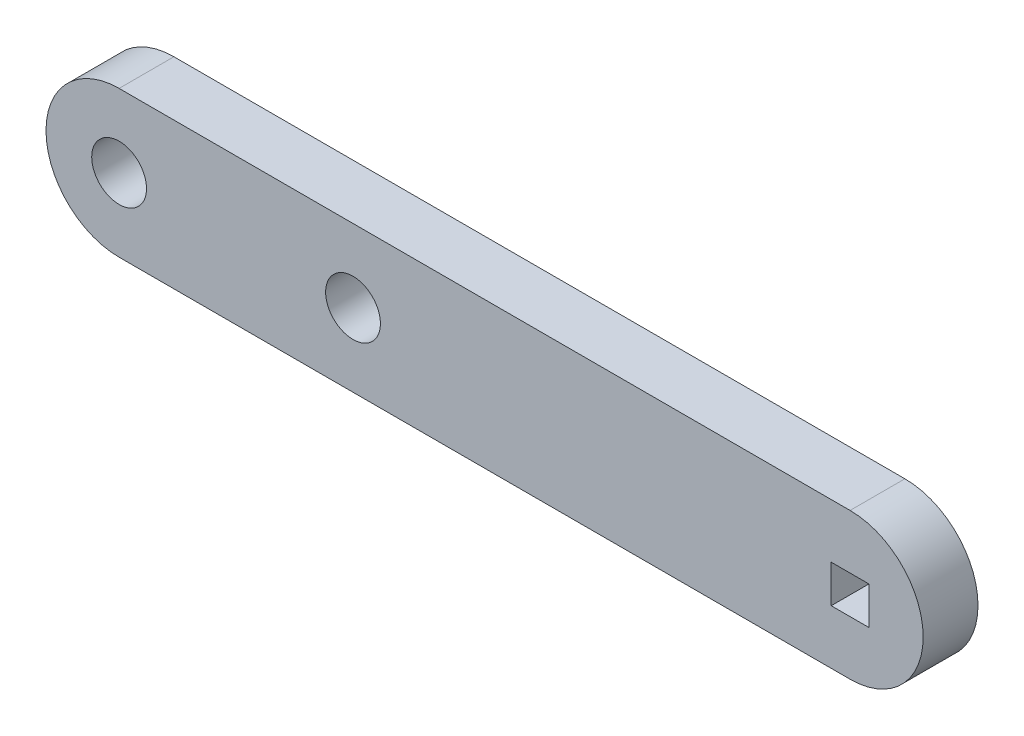
ISO-10303-21;
HEADER;
FILE_DESCRIPTION(('STEP AP214'),'2;1');
FILE_NAME('part.step','',(''),(''),'','','');
FILE_SCHEMA(('AUTOMOTIVE_DESIGN { 1 0 10303 214 1 1 1 1 }'));
ENDSEC;
DATA;
#1=APPLICATION_CONTEXT('core data for automotive mechanical design processes');
#2=APPLICATION_PROTOCOL_DEFINITION('international standard','automotive_design',2000,#1);
#3=PRODUCT_CONTEXT('',#1,'mechanical');
#4=PRODUCT('Part','Part','',(#3));
#5=PRODUCT_RELATED_PRODUCT_CATEGORY('part','',(#4));
#6=PRODUCT_DEFINITION_FORMATION('','',#4);
#7=PRODUCT_DEFINITION_CONTEXT('part definition',#1,'design');
#8=PRODUCT_DEFINITION('design','',#6,#7);
#9=PRODUCT_DEFINITION_SHAPE('','',#8);
#10=(LENGTH_UNIT() NAMED_UNIT(*) SI_UNIT(.MILLI.,.METRE.));
#11=(NAMED_UNIT(*) PLANE_ANGLE_UNIT() SI_UNIT($,.RADIAN.));
#12=(NAMED_UNIT(*) SI_UNIT($,.STERADIAN.) SOLID_ANGLE_UNIT());
#13=UNCERTAINTY_MEASURE_WITH_UNIT(LENGTH_MEASURE(1.E-05),#10,'distance_accuracy_value','');
#14=(GEOMETRIC_REPRESENTATION_CONTEXT(3) GLOBAL_UNCERTAINTY_ASSIGNED_CONTEXT((#13)) GLOBAL_UNIT_ASSIGNED_CONTEXT((#10,
#11,#12)) REPRESENTATION_CONTEXT('',''));
#15=CARTESIAN_POINT('',(0.,0.,0.));
#16=DIRECTION('',(0.,0.,1.));
#17=DIRECTION('',(1.,0.,0.));
#18=AXIS2_PLACEMENT_3D('',#15,#16,#17);
#19=CARTESIAN_POINT('',(0.,0.,4.7625));
#20=DIRECTION('',(0.,0.,1.));
#21=DIRECTION('',(1.,0.,0.));
#22=AXIS2_PLACEMENT_3D('',#19,#20,#21);
#23=PLANE('',#22);
#24=DIRECTION('',(1.,0.,0.));
#25=VECTOR('',#24,1.);
#26=CARTESIAN_POINT('',(65.1383,-1.6383,4.7625));
#27=LINE('',#26,#25);
#28=CARTESIAN_POINT('',(61.8617,-1.6383,4.7625));
#29=VERTEX_POINT('',#28);
#30=CARTESIAN_POINT('',(65.1383,-1.6383,4.7625));
#31=VERTEX_POINT('',#30);
#32=EDGE_CURVE('E106',#29,#31,#27,.T.);
#33=ORIENTED_EDGE('',*,*,#32,.F.);
#34=DIRECTION('',(0.,-1.,0.));
#35=VECTOR('',#34,1.);
#36=CARTESIAN_POINT('',(61.8617,-1.6383,4.7625));
#37=LINE('',#36,#35);
#38=CARTESIAN_POINT('',(61.8617,1.6383,4.7625));
#39=VERTEX_POINT('',#38);
#40=EDGE_CURVE('E98',#39,#29,#37,.T.);
#41=ORIENTED_EDGE('',*,*,#40,.F.);
#42=DIRECTION('',(-1.,0.,0.));
#43=VECTOR('',#42,1.);
#44=CARTESIAN_POINT('',(65.1383,1.6383,4.7625));
#45=LINE('',#44,#43);
#46=CARTESIAN_POINT('',(65.1383,1.6383,4.7625));
#47=VERTEX_POINT('',#46);
#48=EDGE_CURVE('E121',#47,#39,#45,.T.);
#49=ORIENTED_EDGE('',*,*,#48,.F.);
#50=DIRECTION('',(0.,1.,0.));
#51=VECTOR('',#50,1.);
#52=CARTESIAN_POINT('',(65.1383,-1.6383,4.7625));
#53=LINE('',#52,#51);
#54=EDGE_CURVE('E119',#31,#47,#53,.T.);
#55=ORIENTED_EDGE('',*,*,#54,.F.);
#56=EDGE_LOOP('',(#33,#41,#49,#55));
#57=FACE_BOUND('',#56,.T.);
#58=CARTESIAN_POINT('',(0.,0.,4.7625));
#59=DIRECTION('',(0.,0.,1.));
#60=DIRECTION('',(1.,0.,0.));
#61=AXIS2_PLACEMENT_3D('',#58,#59,#60);
#62=CIRCLE('',#61,2.38125);
#63=CARTESIAN_POINT('',(-2.38125,0.,4.7625));
#64=VERTEX_POINT('',#63);
#65=EDGE_CURVE('E137',#64,#64,#62,.T.);
#66=ORIENTED_EDGE('',*,*,#65,.F.);
#67=EDGE_LOOP('',(#66));
#68=FACE_BOUND('',#67,.T.);
#69=CARTESIAN_POINT('',(0.,0.,4.7625));
#70=DIRECTION('',(0.,0.,1.));
#71=DIRECTION('',(1.,0.,0.));
#72=AXIS2_PLACEMENT_3D('',#69,#70,#71);
#73=CIRCLE('',#72,6.35);
#74=CARTESIAN_POINT('',(0.,6.35,4.7625));
#75=VERTEX_POINT('',#74);
#76=CARTESIAN_POINT('',(0.,-6.35,4.7625));
#77=VERTEX_POINT('',#76);
#78=EDGE_CURVE('E143',#75,#77,#73,.T.);
#79=ORIENTED_EDGE('',*,*,#78,.T.);
#80=DIRECTION('',(1.,0.,0.));
#81=VECTOR('',#80,1.);
#82=CARTESIAN_POINT('',(0.,-6.35,4.7625));
#83=LINE('',#82,#81);
#84=CARTESIAN_POINT('',(63.5,-6.35,4.7625));
#85=VERTEX_POINT('',#84);
#86=EDGE_CURVE('E146',#77,#85,#83,.T.);
#87=ORIENTED_EDGE('',*,*,#86,.T.);
#88=CARTESIAN_POINT('',(63.5,0.,4.7625));
#89=DIRECTION('',(0.,0.,1.));
#90=DIRECTION('',(1.,0.,0.));
#91=AXIS2_PLACEMENT_3D('',#88,#89,#90);
#92=CIRCLE('',#91,6.35);
#93=CARTESIAN_POINT('',(63.5,6.35,4.7625));
#94=VERTEX_POINT('',#93);
#95=EDGE_CURVE('E149',#85,#94,#92,.T.);
#96=ORIENTED_EDGE('',*,*,#95,.T.);
#97=DIRECTION('',(-1.,0.,0.));
#98=VECTOR('',#97,1.);
#99=CARTESIAN_POINT('',(0.,6.35,4.7625));
#100=LINE('',#99,#98);
#101=EDGE_CURVE('E151',#94,#75,#100,.T.);
#102=ORIENTED_EDGE('',*,*,#101,.T.);
#103=EDGE_LOOP('',(#79,#87,#96,#102));
#104=FACE_BOUND('',#103,.T.);
#105=CARTESIAN_POINT('',(20.32,0.,4.7625));
#106=DIRECTION('',(0.,0.,1.));
#107=DIRECTION('',(1.,0.,0.));
#108=AXIS2_PLACEMENT_3D('',#105,#106,#107);
#109=CIRCLE('',#108,2.38125);
#110=CARTESIAN_POINT('',(17.93875,0.,4.7625));
#111=VERTEX_POINT('',#110);
#112=EDGE_CURVE('E127',#111,#111,#109,.T.);
#113=ORIENTED_EDGE('',*,*,#112,.F.);
#114=EDGE_LOOP('',(#113));
#115=FACE_BOUND('',#114,.T.);
#116=ADVANCED_FACE('F33',(#57,#68,#104,#115),#23,.T.);
#117=CARTESIAN_POINT('',(0.,0.,0.));
#118=DIRECTION('',(0.,0.,1.));
#119=DIRECTION('',(1.,0.,0.));
#120=AXIS2_PLACEMENT_3D('',#117,#118,#119);
#121=PLANE('',#120);
#122=CARTESIAN_POINT('',(0.,0.,0.));
#123=DIRECTION('',(0.,0.,1.));
#124=DIRECTION('',(1.,0.,0.));
#125=AXIS2_PLACEMENT_3D('',#122,#123,#124);
#126=CIRCLE('',#125,2.38125);
#127=CARTESIAN_POINT('',(-2.38125,0.,0.));
#128=VERTEX_POINT('',#127);
#129=EDGE_CURVE('E114',#128,#128,#126,.T.);
#130=ORIENTED_EDGE('',*,*,#129,.T.);
#131=EDGE_LOOP('',(#130));
#132=FACE_BOUND('',#131,.T.);
#133=CARTESIAN_POINT('',(0.,0.,0.));
#134=DIRECTION('',(0.,0.,1.));
#135=DIRECTION('',(1.,0.,0.));
#136=AXIS2_PLACEMENT_3D('',#133,#134,#135);
#137=CIRCLE('',#136,6.35);
#138=CARTESIAN_POINT('',(0.,6.35,0.));
#139=VERTEX_POINT('',#138);
#140=CARTESIAN_POINT('',(0.,-6.35,0.));
#141=VERTEX_POINT('',#140);
#142=EDGE_CURVE('E140',#139,#141,#137,.T.);
#143=ORIENTED_EDGE('',*,*,#142,.F.);
#144=DIRECTION('',(-1.,0.,0.));
#145=VECTOR('',#144,1.);
#146=CARTESIAN_POINT('',(0.,6.35,0.));
#147=LINE('',#146,#145);
#148=CARTESIAN_POINT('',(63.5,6.35,0.));
#149=VERTEX_POINT('',#148);
#150=EDGE_CURVE('E147',#149,#139,#147,.T.);
#151=ORIENTED_EDGE('',*,*,#150,.F.);
#152=CARTESIAN_POINT('',(63.5,0.,0.));
#153=DIRECTION('',(0.,0.,1.));
#154=DIRECTION('',(1.,0.,0.));
#155=AXIS2_PLACEMENT_3D('',#152,#153,#154);
#156=CIRCLE('',#155,6.35);
#157=CARTESIAN_POINT('',(63.5,-6.35,0.));
#158=VERTEX_POINT('',#157);
#159=EDGE_CURVE('E158',#158,#149,#156,.T.);
#160=ORIENTED_EDGE('',*,*,#159,.F.);
#161=DIRECTION('',(1.,0.,0.));
#162=VECTOR('',#161,1.);
#163=CARTESIAN_POINT('',(0.,-6.35,0.));
#164=LINE('',#163,#162);
#165=EDGE_CURVE('E156',#141,#158,#164,.T.);
#166=ORIENTED_EDGE('',*,*,#165,.F.);
#167=EDGE_LOOP('',(#143,#151,#160,#166));
#168=FACE_BOUND('',#167,.T.);
#169=DIRECTION('',(0.,-1.,0.));
#170=VECTOR('',#169,1.);
#171=CARTESIAN_POINT('',(61.8617,-1.6383,0.));
#172=LINE('',#171,#170);
#173=CARTESIAN_POINT('',(61.8617,1.6383,0.));
#174=VERTEX_POINT('',#173);
#175=CARTESIAN_POINT('',(61.8617,-1.6383,0.));
#176=VERTEX_POINT('',#175);
#177=EDGE_CURVE('E56',#174,#176,#172,.T.);
#178=ORIENTED_EDGE('',*,*,#177,.T.);
#179=DIRECTION('',(1.,0.,0.));
#180=VECTOR('',#179,1.);
#181=CARTESIAN_POINT('',(65.1383,-1.6383,0.));
#182=LINE('',#181,#180);
#183=CARTESIAN_POINT('',(65.1383,-1.6383,0.));
#184=VERTEX_POINT('',#183);
#185=EDGE_CURVE('E113',#176,#184,#182,.T.);
#186=ORIENTED_EDGE('',*,*,#185,.T.);
#187=DIRECTION('',(0.,1.,0.));
#188=VECTOR('',#187,1.);
#189=CARTESIAN_POINT('',(65.1383,-1.6383,0.));
#190=LINE('',#189,#188);
#191=CARTESIAN_POINT('',(65.1383,1.6383,0.));
#192=VERTEX_POINT('',#191);
#193=EDGE_CURVE('E129',#184,#192,#190,.T.);
#194=ORIENTED_EDGE('',*,*,#193,.T.);
#195=DIRECTION('',(-1.,0.,0.));
#196=VECTOR('',#195,1.);
#197=CARTESIAN_POINT('',(65.1383,1.6383,0.));
#198=LINE('',#197,#196);
#199=EDGE_CURVE('E107',#192,#174,#198,.T.);
#200=ORIENTED_EDGE('',*,*,#199,.T.);
#201=EDGE_LOOP('',(#178,#186,#194,#200));
#202=FACE_BOUND('',#201,.T.);
#203=CARTESIAN_POINT('',(20.32,0.,0.));
#204=DIRECTION('',(0.,0.,1.));
#205=DIRECTION('',(1.,0.,0.));
#206=AXIS2_PLACEMENT_3D('',#203,#204,#205);
#207=CIRCLE('',#206,2.38125);
#208=CARTESIAN_POINT('',(17.93875,0.,0.));
#209=VERTEX_POINT('',#208);
#210=EDGE_CURVE('E238',#209,#209,#207,.T.);
#211=ORIENTED_EDGE('',*,*,#210,.T.);
#212=EDGE_LOOP('',(#211));
#213=FACE_BOUND('',#212,.T.);
#214=ADVANCED_FACE('F176',(#132,#168,#202,#213),#121,.F.);
#215=CARTESIAN_POINT('',(0.,0.,4.7625));
#216=DIRECTION('',(0.,0.,-1.));
#217=DIRECTION('',(-1.,0.,0.));
#218=AXIS2_PLACEMENT_3D('',#215,#216,#217);
#219=CYLINDRICAL_SURFACE('',#218,6.35);
#220=ORIENTED_EDGE('',*,*,#142,.T.);
#221=DIRECTION('',(0.,0.,-1.));
#222=VECTOR('',#221,1.);
#223=CARTESIAN_POINT('',(0.,-6.35,4.7625));
#224=LINE('',#223,#222);
#225=EDGE_CURVE('E11',#77,#141,#224,.T.);
#226=ORIENTED_EDGE('',*,*,#225,.F.);
#227=ORIENTED_EDGE('',*,*,#78,.F.);
#228=DIRECTION('',(0.,0.,-1.));
#229=VECTOR('',#228,1.);
#230=CARTESIAN_POINT('',(0.,6.35,4.7625));
#231=LINE('',#230,#229);
#232=EDGE_CURVE('E153',#75,#139,#231,.T.);
#233=ORIENTED_EDGE('',*,*,#232,.T.);
#234=EDGE_LOOP('',(#220,#226,#227,#233));
#235=FACE_BOUND('',#234,.T.);
#236=ADVANCED_FACE('F35',(#235),#219,.T.);
#237=CARTESIAN_POINT('',(0.,-6.35,4.7625));
#238=DIRECTION('',(0.,1.,0.));
#239=DIRECTION('',(-1.,0.,0.));
#240=AXIS2_PLACEMENT_3D('',#237,#238,#239);
#241=PLANE('',#240);
#242=ORIENTED_EDGE('',*,*,#165,.T.);
#243=DIRECTION('',(0.,0.,-1.));
#244=VECTOR('',#243,1.);
#245=CARTESIAN_POINT('',(63.5,-6.35,4.7625));
#246=LINE('',#245,#244);
#247=EDGE_CURVE('E41',#85,#158,#246,.T.);
#248=ORIENTED_EDGE('',*,*,#247,.F.);
#249=ORIENTED_EDGE('',*,*,#86,.F.);
#250=ORIENTED_EDGE('',*,*,#225,.T.);
#251=EDGE_LOOP('',(#242,#248,#249,#250));
#252=FACE_BOUND('',#251,.T.);
#253=ADVANCED_FACE('F187',(#252),#241,.F.);
#254=CARTESIAN_POINT('',(63.5,0.,4.7625));
#255=DIRECTION('',(0.,0.,-1.));
#256=DIRECTION('',(-1.,0.,0.));
#257=AXIS2_PLACEMENT_3D('',#254,#255,#256);
#258=CYLINDRICAL_SURFACE('',#257,6.35);
#259=ORIENTED_EDGE('',*,*,#159,.T.);
#260=DIRECTION('',(0.,0.,-1.));
#261=VECTOR('',#260,1.);
#262=CARTESIAN_POINT('',(63.5,6.35,4.7625));
#263=LINE('',#262,#261);
#264=EDGE_CURVE('E163',#94,#149,#263,.T.);
#265=ORIENTED_EDGE('',*,*,#264,.F.);
#266=ORIENTED_EDGE('',*,*,#95,.F.);
#267=ORIENTED_EDGE('',*,*,#247,.T.);
#268=EDGE_LOOP('',(#259,#265,#266,#267));
#269=FACE_BOUND('',#268,.T.);
#270=ADVANCED_FACE('F170',(#269),#258,.T.);
#271=CARTESIAN_POINT('',(0.,6.35,4.7625));
#272=DIRECTION('',(0.,-1.,0.));
#273=DIRECTION('',(1.,0.,0.));
#274=AXIS2_PLACEMENT_3D('',#271,#272,#273);
#275=PLANE('',#274);
#276=ORIENTED_EDGE('',*,*,#150,.T.);
#277=ORIENTED_EDGE('',*,*,#232,.F.);
#278=ORIENTED_EDGE('',*,*,#101,.F.);
#279=ORIENTED_EDGE('',*,*,#264,.T.);
#280=EDGE_LOOP('',(#276,#277,#278,#279));
#281=FACE_BOUND('',#280,.T.);
#282=ADVANCED_FACE('F180',(#281),#275,.F.);
#283=CARTESIAN_POINT('',(0.,0.,4.7625));
#284=DIRECTION('',(0.,0.,-1.));
#285=DIRECTION('',(-1.,0.,0.));
#286=AXIS2_PLACEMENT_3D('',#283,#284,#285);
#287=CYLINDRICAL_SURFACE('',#286,2.38125);
#288=CARTESIAN_POINT('',(-2.38125,0.,4.7625));
#289=CARTESIAN_POINT('',(-2.38125,0.,4.712890625));
#290=CARTESIAN_POINT('',(-2.38125,0.,4.66328125));
#291=CARTESIAN_POINT('',(-2.38125,0.,4.5640625));
#292=CARTESIAN_POINT('',(-2.38125,0.,4.514453125));
#293=CARTESIAN_POINT('',(-2.38125,0.,4.415234375));
#294=CARTESIAN_POINT('',(-2.38125,0.,4.365625));
#295=CARTESIAN_POINT('',(-2.38125,0.,4.26640625));
#296=CARTESIAN_POINT('',(-2.38125,0.,4.216796875));
#297=CARTESIAN_POINT('',(-2.38125,0.,4.117578125));
#298=CARTESIAN_POINT('',(-2.38125,0.,4.06796875));
#299=CARTESIAN_POINT('',(-2.38125,0.,3.96875));
#300=CARTESIAN_POINT('',(-2.38125,0.,3.919140625));
#301=CARTESIAN_POINT('',(-2.38125,0.,3.819921875));
#302=CARTESIAN_POINT('',(-2.38125,0.,3.7703125));
#303=CARTESIAN_POINT('',(-2.38125,0.,3.67109375));
#304=CARTESIAN_POINT('',(-2.38125,0.,3.621484375));
#305=CARTESIAN_POINT('',(-2.38125,0.,3.522265625));
#306=CARTESIAN_POINT('',(-2.38125,0.,3.47265625));
#307=CARTESIAN_POINT('',(-2.38125,0.,3.3734375));
#308=CARTESIAN_POINT('',(-2.38125,0.,3.323828125));
#309=CARTESIAN_POINT('',(-2.38125,0.,3.224609375));
#310=CARTESIAN_POINT('',(-2.38125,0.,3.175));
#311=CARTESIAN_POINT('',(-2.38125,0.,3.07578125));
#312=CARTESIAN_POINT('',(-2.38125,0.,3.026171875));
#313=CARTESIAN_POINT('',(-2.38125,0.,2.926953125));
#314=CARTESIAN_POINT('',(-2.38125,0.,2.87734375));
#315=CARTESIAN_POINT('',(-2.38125,0.,2.778125));
#316=CARTESIAN_POINT('',(-2.38125,0.,2.728515625));
#317=CARTESIAN_POINT('',(-2.38125,0.,2.629296875));
#318=CARTESIAN_POINT('',(-2.38125,0.,2.5796875));
#319=CARTESIAN_POINT('',(-2.38125,0.,2.48046875));
#320=CARTESIAN_POINT('',(-2.38125,0.,2.430859375));
#321=CARTESIAN_POINT('',(-2.38125,0.,2.331640625));
#322=CARTESIAN_POINT('',(-2.38125,0.,2.28203125));
#323=CARTESIAN_POINT('',(-2.38125,0.,2.1828125));
#324=CARTESIAN_POINT('',(-2.38125,0.,2.133203125));
#325=CARTESIAN_POINT('',(-2.38125,0.,2.033984375));
#326=CARTESIAN_POINT('',(-2.38125,0.,1.984375));
#327=CARTESIAN_POINT('',(-2.38125,0.,1.88515625));
#328=CARTESIAN_POINT('',(-2.38125,0.,1.835546875));
#329=CARTESIAN_POINT('',(-2.38125,0.,1.736328125));
#330=CARTESIAN_POINT('',(-2.38125,0.,1.68671875));
#331=CARTESIAN_POINT('',(-2.38125,0.,1.5875));
#332=CARTESIAN_POINT('',(-2.38125,0.,1.537890625));
#333=CARTESIAN_POINT('',(-2.38125,0.,1.438671875));
#334=CARTESIAN_POINT('',(-2.38125,0.,1.3890625));
#335=CARTESIAN_POINT('',(-2.38125,0.,1.28984375));
#336=CARTESIAN_POINT('',(-2.38125,0.,1.240234375));
#337=CARTESIAN_POINT('',(-2.38125,0.,1.141015625));
#338=CARTESIAN_POINT('',(-2.38125,0.,1.09140625));
#339=CARTESIAN_POINT('',(-2.38125,0.,0.992187499999999));
#340=CARTESIAN_POINT('',(-2.38125,0.,0.942578124999999));
#341=CARTESIAN_POINT('',(-2.38125,0.,0.843359375));
#342=CARTESIAN_POINT('',(-2.38125,0.,0.79375));
#343=CARTESIAN_POINT('',(-2.38125,0.,0.69453125));
#344=CARTESIAN_POINT('',(-2.38125,0.,0.644921875));
#345=CARTESIAN_POINT('',(-2.38125,0.,0.545703125));
#346=CARTESIAN_POINT('',(-2.38125,0.,0.49609375));
#347=CARTESIAN_POINT('',(-2.38125,0.,0.396875));
#348=CARTESIAN_POINT('',(-2.38125,0.,0.347265625));
#349=CARTESIAN_POINT('',(-2.38125,0.,0.248046875));
#350=CARTESIAN_POINT('',(-2.38125,0.,0.1984375));
#351=CARTESIAN_POINT('',(-2.38125,0.,0.09921875));
#352=CARTESIAN_POINT('',(-2.38125,0.,0.049609375));
#353=CARTESIAN_POINT('',(-2.38125,0.,0.));
#354=B_SPLINE_CURVE_WITH_KNOTS('',3,(#288,#289,#290,#291,#292,#293,#294,#295,#296,#297,#298,
#299,#300,#301,#302,#303,#304,#305,#306,#307,#308,#309,#310,#311,#312,#313,#314,#315,#316,#317,
#318,#319,#320,#321,#322,#323,#324,#325,#326,#327,#328,#329,#330,#331,#332,#333,#334,#335,#336,
#337,#338,#339,#340,#341,#342,#343,#344,#345,#346,#347,#348,#349,#350,#351,#352,#353),
.UNSPECIFIED.,.F.,.F.,(4,2,2,2,2,2,2,2,2,2,2,2,2,2,2,2,2,2,2,2,2,2,2,2,2,2,2,2,2,2,2,2,4),(0.,
0.148828125,0.29765625,0.446484375,0.5953125,0.744140625,0.892968750000001,1.041796875,1.190625,
1.339453125,1.48828125,1.637109375,1.7859375,1.934765625,2.08359375,2.232421875,2.38125,
2.530078125,2.67890625,2.827734375,2.9765625,3.125390625,3.27421875,3.423046875,3.571875,
3.720703125,3.86953125,4.018359375,4.1671875,4.316015625,4.46484375,4.613671875,4.7625),.UNSPECIFIED.);
#355=EDGE_CURVE('BSEAM202',#64,#128,#354,.T.);
#356=ORIENTED_EDGE('',*,*,#65,.T.);
#357=ORIENTED_EDGE('',*,*,#129,.F.);
#358=ORIENTED_EDGE('',*,*,#355,.T.);
#359=ORIENTED_EDGE('',*,*,#355,.F.);
#360=EDGE_LOOP('',(#356,#358,#357,#359));
#361=FACE_BOUND('',#360,.T.);
#362=ADVANCED_FACE('F202',(#361),#287,.F.);
#363=CARTESIAN_POINT('',(61.8617,-1.6383,4.7625));
#364=DIRECTION('',(1.,0.,0.));
#365=DIRECTION('',(0.,0.,-1.));
#366=AXIS2_PLACEMENT_3D('',#363,#364,#365);
#367=PLANE('',#366);
#368=ORIENTED_EDGE('',*,*,#177,.F.);
#369=DIRECTION('',(0.,0.,-1.));
#370=VECTOR('',#369,1.);
#371=CARTESIAN_POINT('',(61.8617,1.6383,4.7625));
#372=LINE('',#371,#370);
#373=EDGE_CURVE('E102',#39,#174,#372,.T.);
#374=ORIENTED_EDGE('',*,*,#373,.F.);
#375=ORIENTED_EDGE('',*,*,#40,.T.);
#376=DIRECTION('',(0.,0.,-1.));
#377=VECTOR('',#376,1.);
#378=CARTESIAN_POINT('',(61.8617,-1.6383,4.7625));
#379=LINE('',#378,#377);
#380=EDGE_CURVE('E101',#29,#176,#379,.T.);
#381=ORIENTED_EDGE('',*,*,#380,.T.);
#382=EDGE_LOOP('',(#368,#374,#375,#381));
#383=FACE_BOUND('',#382,.T.);
#384=ADVANCED_FACE('F100',(#383),#367,.T.);
#385=CARTESIAN_POINT('',(65.1383,-1.6383,4.7625));
#386=DIRECTION('',(0.,1.,0.));
#387=DIRECTION('',(-1.,0.,0.));
#388=AXIS2_PLACEMENT_3D('',#385,#386,#387);
#389=PLANE('',#388);
#390=ORIENTED_EDGE('',*,*,#185,.F.);
#391=ORIENTED_EDGE('',*,*,#380,.F.);
#392=ORIENTED_EDGE('',*,*,#32,.T.);
#393=DIRECTION('',(0.,0.,-1.));
#394=VECTOR('',#393,1.);
#395=CARTESIAN_POINT('',(65.1383,-1.6383,4.7625));
#396=LINE('',#395,#394);
#397=EDGE_CURVE('E115',#31,#184,#396,.T.);
#398=ORIENTED_EDGE('',*,*,#397,.T.);
#399=EDGE_LOOP('',(#390,#391,#392,#398));
#400=FACE_BOUND('',#399,.T.);
#401=ADVANCED_FACE('F110',(#400),#389,.T.);
#402=CARTESIAN_POINT('',(65.1383,-1.6383,4.7625));
#403=DIRECTION('',(-1.,0.,0.));
#404=DIRECTION('',(0.,0.,1.));
#405=AXIS2_PLACEMENT_3D('',#402,#403,#404);
#406=PLANE('',#405);
#407=ORIENTED_EDGE('',*,*,#193,.F.);
#408=ORIENTED_EDGE('',*,*,#397,.F.);
#409=ORIENTED_EDGE('',*,*,#54,.T.);
#410=DIRECTION('',(0.,0.,-1.));
#411=VECTOR('',#410,1.);
#412=CARTESIAN_POINT('',(65.1383,1.6383,4.7625));
#413=LINE('',#412,#411);
#414=EDGE_CURVE('E48',#47,#192,#413,.T.);
#415=ORIENTED_EDGE('',*,*,#414,.T.);
#416=EDGE_LOOP('',(#407,#408,#409,#415));
#417=FACE_BOUND('',#416,.T.);
#418=ADVANCED_FACE('F219',(#417),#406,.T.);
#419=CARTESIAN_POINT('',(65.1383,1.6383,4.7625));
#420=DIRECTION('',(0.,-1.,0.));
#421=DIRECTION('',(1.,0.,0.));
#422=AXIS2_PLACEMENT_3D('',#419,#420,#421);
#423=PLANE('',#422);
#424=ORIENTED_EDGE('',*,*,#199,.F.);
#425=ORIENTED_EDGE('',*,*,#414,.F.);
#426=ORIENTED_EDGE('',*,*,#48,.T.);
#427=ORIENTED_EDGE('',*,*,#373,.T.);
#428=EDGE_LOOP('',(#424,#425,#426,#427));
#429=FACE_BOUND('',#428,.T.);
#430=ADVANCED_FACE('F224',(#429),#423,.T.);
#431=CARTESIAN_POINT('',(20.32,0.,4.7625));
#432=DIRECTION('',(0.,0.,-1.));
#433=DIRECTION('',(-1.,0.,0.));
#434=AXIS2_PLACEMENT_3D('',#431,#432,#433);
#435=CYLINDRICAL_SURFACE('',#434,2.38125);
#436=CARTESIAN_POINT('',(17.93875,0.,4.7625));
#437=CARTESIAN_POINT('',(17.93875,0.,4.712890625));
#438=CARTESIAN_POINT('',(17.93875,0.,4.66328125));
#439=CARTESIAN_POINT('',(17.93875,0.,4.5640625));
#440=CARTESIAN_POINT('',(17.93875,0.,4.514453125));
#441=CARTESIAN_POINT('',(17.93875,0.,4.415234375));
#442=CARTESIAN_POINT('',(17.93875,0.,4.365625));
#443=CARTESIAN_POINT('',(17.93875,0.,4.26640625));
#444=CARTESIAN_POINT('',(17.93875,0.,4.216796875));
#445=CARTESIAN_POINT('',(17.93875,0.,4.117578125));
#446=CARTESIAN_POINT('',(17.93875,0.,4.06796875));
#447=CARTESIAN_POINT('',(17.93875,0.,3.96875));
#448=CARTESIAN_POINT('',(17.93875,0.,3.919140625));
#449=CARTESIAN_POINT('',(17.93875,0.,3.819921875));
#450=CARTESIAN_POINT('',(17.93875,0.,3.7703125));
#451=CARTESIAN_POINT('',(17.93875,0.,3.67109375));
#452=CARTESIAN_POINT('',(17.93875,0.,3.621484375));
#453=CARTESIAN_POINT('',(17.93875,0.,3.522265625));
#454=CARTESIAN_POINT('',(17.93875,0.,3.47265625));
#455=CARTESIAN_POINT('',(17.93875,0.,3.3734375));
#456=CARTESIAN_POINT('',(17.93875,0.,3.323828125));
#457=CARTESIAN_POINT('',(17.93875,0.,3.224609375));
#458=CARTESIAN_POINT('',(17.93875,0.,3.175));
#459=CARTESIAN_POINT('',(17.93875,0.,3.07578125));
#460=CARTESIAN_POINT('',(17.93875,0.,3.026171875));
#461=CARTESIAN_POINT('',(17.93875,0.,2.926953125));
#462=CARTESIAN_POINT('',(17.93875,0.,2.87734375));
#463=CARTESIAN_POINT('',(17.93875,0.,2.778125));
#464=CARTESIAN_POINT('',(17.93875,0.,2.728515625));
#465=CARTESIAN_POINT('',(17.93875,0.,2.629296875));
#466=CARTESIAN_POINT('',(17.93875,0.,2.5796875));
#467=CARTESIAN_POINT('',(17.93875,0.,2.48046875));
#468=CARTESIAN_POINT('',(17.93875,0.,2.430859375));
#469=CARTESIAN_POINT('',(17.93875,0.,2.331640625));
#470=CARTESIAN_POINT('',(17.93875,0.,2.28203125));
#471=CARTESIAN_POINT('',(17.93875,0.,2.1828125));
#472=CARTESIAN_POINT('',(17.93875,0.,2.133203125));
#473=CARTESIAN_POINT('',(17.93875,0.,2.033984375));
#474=CARTESIAN_POINT('',(17.93875,0.,1.984375));
#475=CARTESIAN_POINT('',(17.93875,0.,1.88515625));
#476=CARTESIAN_POINT('',(17.93875,0.,1.835546875));
#477=CARTESIAN_POINT('',(17.93875,0.,1.736328125));
#478=CARTESIAN_POINT('',(17.93875,0.,1.68671875));
#479=CARTESIAN_POINT('',(17.93875,0.,1.5875));
#480=CARTESIAN_POINT('',(17.93875,0.,1.537890625));
#481=CARTESIAN_POINT('',(17.93875,0.,1.438671875));
#482=CARTESIAN_POINT('',(17.93875,0.,1.3890625));
#483=CARTESIAN_POINT('',(17.93875,0.,1.28984375));
#484=CARTESIAN_POINT('',(17.93875,0.,1.240234375));
#485=CARTESIAN_POINT('',(17.93875,0.,1.141015625));
#486=CARTESIAN_POINT('',(17.93875,0.,1.09140625));
#487=CARTESIAN_POINT('',(17.93875,0.,0.992187499999999));
#488=CARTESIAN_POINT('',(17.93875,0.,0.942578124999999));
#489=CARTESIAN_POINT('',(17.93875,0.,0.843359375));
#490=CARTESIAN_POINT('',(17.93875,0.,0.79375));
#491=CARTESIAN_POINT('',(17.93875,0.,0.69453125));
#492=CARTESIAN_POINT('',(17.93875,0.,0.644921875));
#493=CARTESIAN_POINT('',(17.93875,0.,0.545703125));
#494=CARTESIAN_POINT('',(17.93875,0.,0.49609375));
#495=CARTESIAN_POINT('',(17.93875,0.,0.396875));
#496=CARTESIAN_POINT('',(17.93875,0.,0.347265625));
#497=CARTESIAN_POINT('',(17.93875,0.,0.248046875));
#498=CARTESIAN_POINT('',(17.93875,0.,0.1984375));
#499=CARTESIAN_POINT('',(17.93875,0.,0.09921875));
#500=CARTESIAN_POINT('',(17.93875,0.,0.049609375));
#501=CARTESIAN_POINT('',(17.93875,0.,0.));
#502=B_SPLINE_CURVE_WITH_KNOTS('',3,(#436,#437,#438,#439,#440,#441,#442,#443,#444,#445,#446,
#447,#448,#449,#450,#451,#452,#453,#454,#455,#456,#457,#458,#459,#460,#461,#462,#463,#464,#465,
#466,#467,#468,#469,#470,#471,#472,#473,#474,#475,#476,#477,#478,#479,#480,#481,#482,#483,#484,
#485,#486,#487,#488,#489,#490,#491,#492,#493,#494,#495,#496,#497,#498,#499,#500,#501),
.UNSPECIFIED.,.F.,.F.,(4,2,2,2,2,2,2,2,2,2,2,2,2,2,2,2,2,2,2,2,2,2,2,2,2,2,2,2,2,2,2,2,4),(0.,
0.148828125,0.29765625,0.446484375,0.5953125,0.744140625,0.892968750000001,1.041796875,1.190625,
1.339453125,1.48828125,1.637109375,1.7859375,1.934765625,2.08359375,2.232421875,2.38125,
2.530078125,2.67890625,2.827734375,2.9765625,3.125390625,3.27421875,3.423046875,3.571875,
3.720703125,3.86953125,4.018359375,4.1671875,4.316015625,4.46484375,4.613671875,4.7625),.UNSPECIFIED.);
#503=EDGE_CURVE('BSEAM228',#111,#209,#502,.T.);
#504=ORIENTED_EDGE('',*,*,#112,.T.);
#505=ORIENTED_EDGE('',*,*,#210,.F.);
#506=ORIENTED_EDGE('',*,*,#503,.T.);
#507=ORIENTED_EDGE('',*,*,#503,.F.);
#508=EDGE_LOOP('',(#504,#506,#505,#507));
#509=FACE_BOUND('',#508,.T.);
#510=ADVANCED_FACE('F228',(#509),#435,.F.);
#511=CLOSED_SHELL('',(#116,#214,#236,#253,#270,#282,#362,#384,#401,#418,#430,#510));
#512=MANIFOLD_SOLID_BREP('B2',#511);
#513=ADVANCED_BREP_SHAPE_REPRESENTATION('',(#18,#512),#14);
#514=SHAPE_DEFINITION_REPRESENTATION(#9,#513);
ENDSEC;
END-ISO-10303-21;
